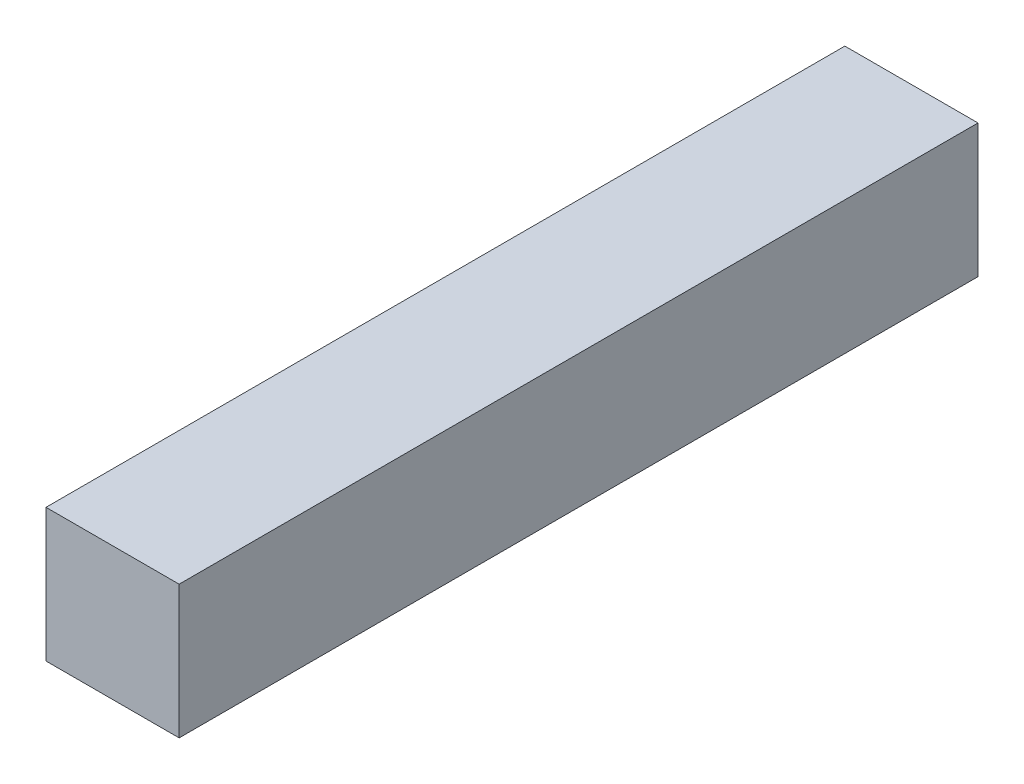
ISO-10303-21;
HEADER;
FILE_DESCRIPTION(('STEP AP214'),'2;1');
FILE_NAME('part.step','',(''),(''),'','','');
FILE_SCHEMA(('AUTOMOTIVE_DESIGN { 1 0 10303 214 1 1 1 1 }'));
ENDSEC;
DATA;
#1=APPLICATION_CONTEXT('core data for automotive mechanical design processes');
#2=APPLICATION_PROTOCOL_DEFINITION('international standard','automotive_design',2000,#1);
#3=PRODUCT_CONTEXT('',#1,'mechanical');
#4=PRODUCT('Part','Part','',(#3));
#5=PRODUCT_RELATED_PRODUCT_CATEGORY('part','',(#4));
#6=PRODUCT_DEFINITION_FORMATION('','',#4);
#7=PRODUCT_DEFINITION_CONTEXT('part definition',#1,'design');
#8=PRODUCT_DEFINITION('design','',#6,#7);
#9=PRODUCT_DEFINITION_SHAPE('','',#8);
#10=(LENGTH_UNIT() NAMED_UNIT(*) SI_UNIT(.MILLI.,.METRE.));
#11=(NAMED_UNIT(*) PLANE_ANGLE_UNIT() SI_UNIT($,.RADIAN.));
#12=(NAMED_UNIT(*) SI_UNIT($,.STERADIAN.) SOLID_ANGLE_UNIT());
#13=UNCERTAINTY_MEASURE_WITH_UNIT(LENGTH_MEASURE(1.E-05),#10,'distance_accuracy_value','');
#14=(GEOMETRIC_REPRESENTATION_CONTEXT(3) GLOBAL_UNCERTAINTY_ASSIGNED_CONTEXT((#13)) GLOBAL_UNIT_ASSIGNED_CONTEXT((#10,
#11,#12)) REPRESENTATION_CONTEXT('',''));
#15=CARTESIAN_POINT('',(0.,0.,0.));
#16=DIRECTION('',(0.,0.,1.));
#17=DIRECTION('',(1.,0.,0.));
#18=AXIS2_PLACEMENT_3D('',#15,#16,#17);
#19=CARTESIAN_POINT('',(-10.,10.,120.));
#20=DIRECTION('',(1.,0.,0.));
#21=DIRECTION('',(0.,1.,0.));
#22=AXIS2_PLACEMENT_3D('',#19,#20,#21);
#23=PLANE('',#22);
#24=DIRECTION('',(0.,-1.,0.));
#25=VECTOR('',#24,1.);
#26=CARTESIAN_POINT('',(-10.,10.,0.));
#27=LINE('',#26,#25);
#28=CARTESIAN_POINT('',(-10.,10.,0.));
#29=VERTEX_POINT('',#28);
#30=CARTESIAN_POINT('',(-10.,-10.,0.));
#31=VERTEX_POINT('',#30);
#32=EDGE_CURVE('E97',#29,#31,#27,.T.);
#33=ORIENTED_EDGE('',*,*,#32,.T.);
#34=DIRECTION('',(0.,0.,-1.));
#35=VECTOR('',#34,1.);
#36=CARTESIAN_POINT('',(-10.,-10.,120.));
#37=LINE('',#36,#35);
#38=CARTESIAN_POINT('',(-10.,-10.,120.));
#39=VERTEX_POINT('',#38);
#40=EDGE_CURVE('E11',#39,#31,#37,.T.);
#41=ORIENTED_EDGE('',*,*,#40,.F.);
#42=DIRECTION('',(0.,-1.,0.));
#43=VECTOR('',#42,1.);
#44=CARTESIAN_POINT('',(-10.,10.,120.));
#45=LINE('',#44,#43);
#46=CARTESIAN_POINT('',(-10.,10.,120.));
#47=VERTEX_POINT('',#46);
#48=EDGE_CURVE('E85',#47,#39,#45,.T.);
#49=ORIENTED_EDGE('',*,*,#48,.F.);
#50=DIRECTION('',(0.,0.,-1.));
#51=VECTOR('',#50,1.);
#52=CARTESIAN_POINT('',(-10.,10.,120.));
#53=LINE('',#52,#51);
#54=EDGE_CURVE('E93',#47,#29,#53,.T.);
#55=ORIENTED_EDGE('',*,*,#54,.T.);
#56=EDGE_LOOP('',(#33,#41,#49,#55));
#57=FACE_BOUND('',#56,.T.);
#58=ADVANCED_FACE('F34',(#57),#23,.F.);
#59=CARTESIAN_POINT('',(-10.,-10.,120.));
#60=DIRECTION('',(0.,1.,0.));
#61=DIRECTION('',(0.,0.,1.));
#62=AXIS2_PLACEMENT_3D('',#59,#60,#61);
#63=PLANE('',#62);
#64=DIRECTION('',(1.,0.,0.));
#65=VECTOR('',#64,1.);
#66=CARTESIAN_POINT('',(-10.,-10.,0.));
#67=LINE('',#66,#65);
#68=CARTESIAN_POINT('',(10.,-10.,0.));
#69=VERTEX_POINT('',#68);
#70=EDGE_CURVE('E89',#31,#69,#67,.T.);
#71=ORIENTED_EDGE('',*,*,#70,.T.);
#72=DIRECTION('',(0.,0.,-1.));
#73=VECTOR('',#72,1.);
#74=CARTESIAN_POINT('',(10.,-10.,120.));
#75=LINE('',#74,#73);
#76=CARTESIAN_POINT('',(10.,-10.,120.));
#77=VERTEX_POINT('',#76);
#78=EDGE_CURVE('E42',#77,#69,#75,.T.);
#79=ORIENTED_EDGE('',*,*,#78,.F.);
#80=DIRECTION('',(1.,0.,0.));
#81=VECTOR('',#80,1.);
#82=CARTESIAN_POINT('',(-10.,-10.,120.));
#83=LINE('',#82,#81);
#84=EDGE_CURVE('E80',#39,#77,#83,.T.);
#85=ORIENTED_EDGE('',*,*,#84,.F.);
#86=ORIENTED_EDGE('',*,*,#40,.T.);
#87=EDGE_LOOP('',(#71,#79,#85,#86));
#88=FACE_BOUND('',#87,.T.);
#89=ADVANCED_FACE('F88',(#88),#63,.F.);
#90=CARTESIAN_POINT('',(10.,10.,120.));
#91=DIRECTION('',(-1.,0.,0.));
#92=DIRECTION('',(0.,0.,1.));
#93=AXIS2_PLACEMENT_3D('',#90,#91,#92);
#94=PLANE('',#93);
#95=DIRECTION('',(0.,1.,0.));
#96=VECTOR('',#95,1.);
#97=CARTESIAN_POINT('',(10.,10.,0.));
#98=LINE('',#97,#96);
#99=CARTESIAN_POINT('',(10.,10.,0.));
#100=VERTEX_POINT('',#99);
#101=EDGE_CURVE('E67',#69,#100,#98,.T.);
#102=ORIENTED_EDGE('',*,*,#101,.T.);
#103=DIRECTION('',(0.,0.,-1.));
#104=VECTOR('',#103,1.);
#105=CARTESIAN_POINT('',(10.,10.,120.));
#106=LINE('',#105,#104);
#107=CARTESIAN_POINT('',(10.,10.,120.));
#108=VERTEX_POINT('',#107);
#109=EDGE_CURVE('E90',#108,#100,#106,.T.);
#110=ORIENTED_EDGE('',*,*,#109,.F.);
#111=DIRECTION('',(0.,1.,0.));
#112=VECTOR('',#111,1.);
#113=CARTESIAN_POINT('',(10.,10.,120.));
#114=LINE('',#113,#112);
#115=EDGE_CURVE('E83',#77,#108,#114,.T.);
#116=ORIENTED_EDGE('',*,*,#115,.F.);
#117=ORIENTED_EDGE('',*,*,#78,.T.);
#118=EDGE_LOOP('',(#102,#110,#116,#117));
#119=FACE_BOUND('',#118,.T.);
#120=ADVANCED_FACE('F91',(#119),#94,.F.);
#121=CARTESIAN_POINT('',(-10.,10.,120.));
#122=DIRECTION('',(0.,-1.,0.));
#123=DIRECTION('',(0.,0.,-1.));
#124=AXIS2_PLACEMENT_3D('',#121,#122,#123);
#125=PLANE('',#124);
#126=DIRECTION('',(-1.,0.,0.));
#127=VECTOR('',#126,1.);
#128=CARTESIAN_POINT('',(-10.,10.,0.));
#129=LINE('',#128,#127);
#130=EDGE_CURVE('E73',#100,#29,#129,.T.);
#131=ORIENTED_EDGE('',*,*,#130,.T.);
#132=ORIENTED_EDGE('',*,*,#54,.F.);
#133=DIRECTION('',(-1.,0.,0.));
#134=VECTOR('',#133,1.);
#135=CARTESIAN_POINT('',(-10.,10.,120.));
#136=LINE('',#135,#134);
#137=EDGE_CURVE('E50',#108,#47,#136,.T.);
#138=ORIENTED_EDGE('',*,*,#137,.F.);
#139=ORIENTED_EDGE('',*,*,#109,.T.);
#140=EDGE_LOOP('',(#131,#132,#138,#139));
#141=FACE_BOUND('',#140,.T.);
#142=ADVANCED_FACE('F104',(#141),#125,.F.);
#143=CARTESIAN_POINT('',(0.,0.,120.));
#144=DIRECTION('',(0.,0.,1.));
#145=DIRECTION('',(1.,0.,0.));
#146=AXIS2_PLACEMENT_3D('',#143,#144,#145);
#147=PLANE('',#146);
#148=ORIENTED_EDGE('',*,*,#48,.T.);
#149=ORIENTED_EDGE('',*,*,#84,.T.);
#150=ORIENTED_EDGE('',*,*,#115,.T.);
#151=ORIENTED_EDGE('',*,*,#137,.T.);
#152=EDGE_LOOP('',(#148,#149,#150,#151));
#153=FACE_BOUND('',#152,.T.);
#154=ADVANCED_FACE('F81',(#153),#147,.T.);
#155=CARTESIAN_POINT('',(0.,0.,0.));
#156=DIRECTION('',(0.,0.,1.));
#157=DIRECTION('',(1.,0.,0.));
#158=AXIS2_PLACEMENT_3D('',#155,#156,#157);
#159=PLANE('',#158);
#160=ORIENTED_EDGE('',*,*,#32,.F.);
#161=ORIENTED_EDGE('',*,*,#130,.F.);
#162=ORIENTED_EDGE('',*,*,#101,.F.);
#163=ORIENTED_EDGE('',*,*,#70,.F.);
#164=EDGE_LOOP('',(#160,#161,#162,#163));
#165=FACE_BOUND('',#164,.T.);
#166=ADVANCED_FACE('F107',(#165),#159,.F.);
#167=CLOSED_SHELL('',(#58,#89,#120,#142,#154,#166));
#168=MANIFOLD_SOLID_BREP('B2',#167);
#169=ADVANCED_BREP_SHAPE_REPRESENTATION('',(#18,#168),#14);
#170=SHAPE_DEFINITION_REPRESENTATION(#9,#169);
ENDSEC;
END-ISO-10303-21;
